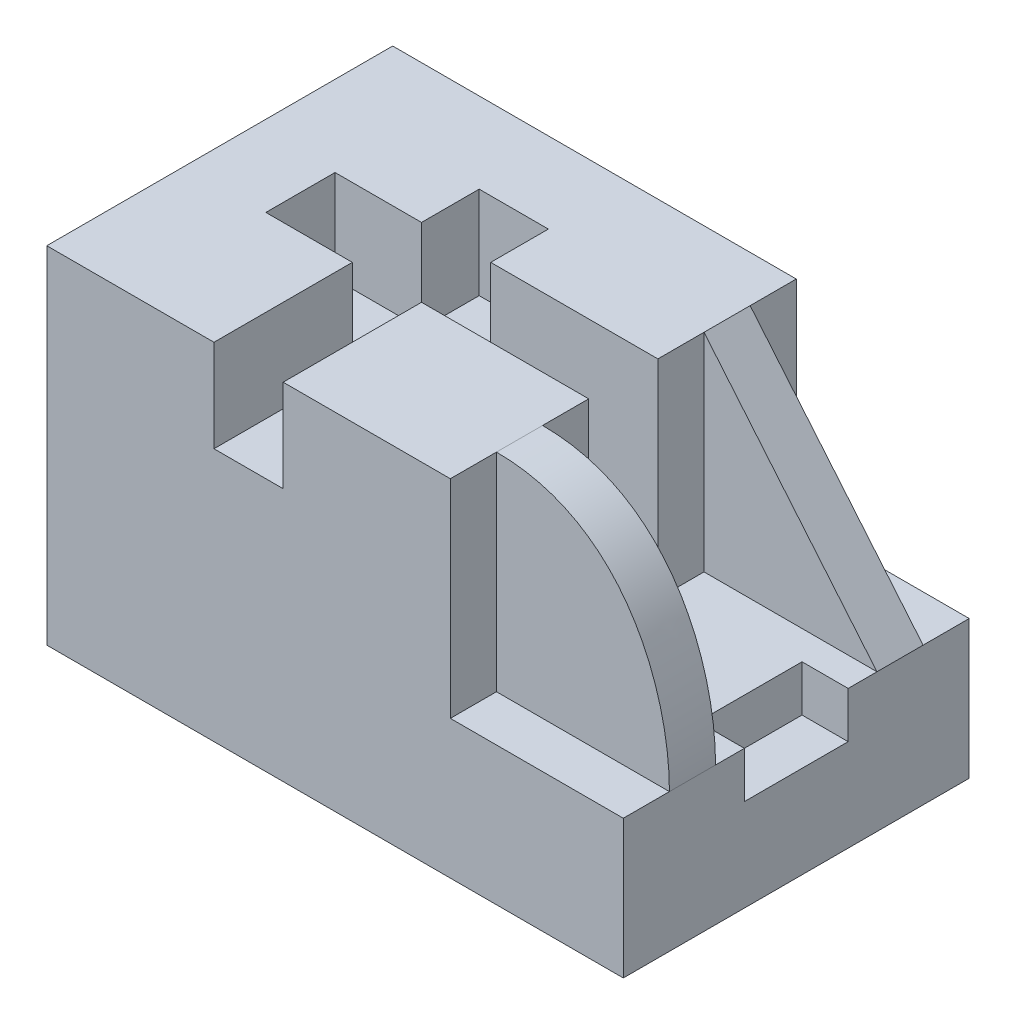
ISO-10303-21;
HEADER;
FILE_DESCRIPTION(('STEP AP214'),'2;1');
FILE_NAME('part.step','',(''),(''),'','','');
FILE_SCHEMA(('AUTOMOTIVE_DESIGN { 1 0 10303 214 1 1 1 1 }'));
ENDSEC;
DATA;
#1=APPLICATION_CONTEXT('core data for automotive mechanical design processes');
#2=APPLICATION_PROTOCOL_DEFINITION('international standard','automotive_design',2000,#1);
#3=PRODUCT_CONTEXT('',#1,'mechanical');
#4=PRODUCT('Part','Part','',(#3));
#5=PRODUCT_RELATED_PRODUCT_CATEGORY('part','',(#4));
#6=PRODUCT_DEFINITION_FORMATION('','',#4);
#7=PRODUCT_DEFINITION_CONTEXT('part definition',#1,'design');
#8=PRODUCT_DEFINITION('design','',#6,#7);
#9=PRODUCT_DEFINITION_SHAPE('','',#8);
#10=(LENGTH_UNIT() NAMED_UNIT(*) SI_UNIT(.MILLI.,.METRE.));
#11=(NAMED_UNIT(*) PLANE_ANGLE_UNIT() SI_UNIT($,.RADIAN.));
#12=(NAMED_UNIT(*) SI_UNIT($,.STERADIAN.) SOLID_ANGLE_UNIT());
#13=UNCERTAINTY_MEASURE_WITH_UNIT(LENGTH_MEASURE(1.E-05),#10,'distance_accuracy_value','');
#14=(GEOMETRIC_REPRESENTATION_CONTEXT(3) GLOBAL_UNCERTAINTY_ASSIGNED_CONTEXT((#13)) GLOBAL_UNIT_ASSIGNED_CONTEXT((#10,
#11,#12)) REPRESENTATION_CONTEXT('',''));
#15=CARTESIAN_POINT('',(0.,0.,0.));
#16=DIRECTION('',(0.,0.,1.));
#17=DIRECTION('',(1.,0.,0.));
#18=AXIS2_PLACEMENT_3D('',#15,#16,#17);
#19=CARTESIAN_POINT('',(25.,-3.,0.));
#20=DIRECTION('',(0.,-1.,0.));
#21=DIRECTION('',(1.,0.,0.));
#22=AXIS2_PLACEMENT_3D('',#19,#20,#21);
#23=PLANE('',#22);
#24=DIRECTION('',(-1.,0.,0.));
#25=VECTOR('',#24,1.);
#26=CARTESIAN_POINT('',(25.,-3.,4.));
#27=LINE('',#26,#25);
#28=CARTESIAN_POINT('',(25.,-3.,4.));
#29=VERTEX_POINT('',#28);
#30=CARTESIAN_POINT('',(10.,-3.,4.));
#31=VERTEX_POINT('',#30);
#32=EDGE_CURVE('E270',#29,#31,#27,.T.);
#33=ORIENTED_EDGE('',*,*,#32,.F.);
#34=DIRECTION('',(0.,0.,1.));
#35=VECTOR('',#34,1.);
#36=CARTESIAN_POINT('',(25.,-3.,0.));
#37=LINE('',#36,#35);
#38=CARTESIAN_POINT('',(25.,-3.,0.));
#39=VERTEX_POINT('',#38);
#40=EDGE_CURVE('E554',#39,#29,#37,.T.);
#41=ORIENTED_EDGE('',*,*,#40,.F.);
#42=DIRECTION('',(1.,0.,0.));
#43=VECTOR('',#42,1.);
#44=CARTESIAN_POINT('',(25.,-3.,0.));
#45=LINE('',#44,#43);
#46=CARTESIAN_POINT('',(10.,-3.,0.));
#47=VERTEX_POINT('',#46);
#48=EDGE_CURVE('E545',#47,#39,#45,.T.);
#49=ORIENTED_EDGE('',*,*,#48,.F.);
#50=DIRECTION('',(0.,0.,1.));
#51=VECTOR('',#50,1.);
#52=CARTESIAN_POINT('',(10.,-3.,0.));
#53=LINE('',#52,#51);
#54=EDGE_CURVE('E559',#47,#31,#53,.T.);
#55=ORIENTED_EDGE('',*,*,#54,.T.);
#56=EDGE_LOOP('',(#33,#41,#49,#55));
#57=FACE_BOUND('',#56,.T.);
#58=ADVANCED_FACE('F34',(#57),#23,.F.);
#59=CARTESIAN_POINT('',(10.,15.,0.));
#60=DIRECTION('',(-1.,0.,0.));
#61=DIRECTION('',(0.,-1.,0.));
#62=AXIS2_PLACEMENT_3D('',#59,#60,#61);
#63=PLANE('',#62);
#64=DIRECTION('',(0.,1.,0.));
#65=VECTOR('',#64,1.);
#66=CARTESIAN_POINT('',(10.,15.,4.));
#67=LINE('',#66,#65);
#68=CARTESIAN_POINT('',(10.,15.,4.));
#69=VERTEX_POINT('',#68);
#70=EDGE_CURVE('E11',#31,#69,#67,.T.);
#71=ORIENTED_EDGE('',*,*,#70,.F.);
#72=ORIENTED_EDGE('',*,*,#54,.F.);
#73=DIRECTION('',(0.,-1.,0.));
#74=VECTOR('',#73,1.);
#75=CARTESIAN_POINT('',(10.,15.,0.));
#76=LINE('',#75,#74);
#77=CARTESIAN_POINT('',(10.,15.,0.));
#78=VERTEX_POINT('',#77);
#79=EDGE_CURVE('E542',#78,#47,#76,.T.);
#80=ORIENTED_EDGE('',*,*,#79,.F.);
#81=DIRECTION('',(0.,0.,1.));
#82=VECTOR('',#81,1.);
#83=CARTESIAN_POINT('',(10.,15.,0.));
#84=LINE('',#83,#82);
#85=EDGE_CURVE('E564',#78,#69,#84,.T.);
#86=ORIENTED_EDGE('',*,*,#85,.T.);
#87=EDGE_LOOP('',(#71,#72,#80,#86));
#88=FACE_BOUND('',#87,.T.);
#89=ADVANCED_FACE('F369',(#88),#63,.F.);
#90=DIRECTION('',(0.,1.,0.));
#91=VECTOR('',#90,1.);
#92=CARTESIAN_POINT('',(10.,15.,22.));
#93=LINE('',#92,#91);
#94=CARTESIAN_POINT('',(10.,-3.,22.));
#95=VERTEX_POINT('',#94);
#96=CARTESIAN_POINT('',(10.,15.,22.));
#97=VERTEX_POINT('',#96);
#98=EDGE_CURVE('E450',#95,#97,#93,.T.);
#99=ORIENTED_EDGE('',*,*,#98,.F.);
#100=CARTESIAN_POINT('',(10.,-3.,18.));
#101=VERTEX_POINT('',#100);
#102=EDGE_CURVE('E563',#101,#95,#53,.T.);
#103=ORIENTED_EDGE('',*,*,#102,.F.);
#104=DIRECTION('',(0.,1.,0.));
#105=VECTOR('',#104,1.);
#106=CARTESIAN_POINT('',(10.,-18.6923548264752,18.));
#107=LINE('',#106,#105);
#108=CARTESIAN_POINT('',(10.,15.,18.));
#109=VERTEX_POINT('',#108);
#110=EDGE_CURVE('E522',#101,#109,#107,.T.);
#111=ORIENTED_EDGE('',*,*,#110,.T.);
#112=EDGE_CURVE('E569',#109,#97,#84,.T.);
#113=ORIENTED_EDGE('',*,*,#112,.T.);
#114=EDGE_LOOP('',(#99,#103,#111,#113));
#115=FACE_BOUND('',#114,.T.);
#116=ADVANCED_FACE('F399',(#115),#63,.F.);
#117=DIRECTION('',(0.,0.,1.));
#118=VECTOR('',#117,1.);
#119=CARTESIAN_POINT('',(21.,-3.,19.5));
#120=LINE('',#119,#118);
#121=CARTESIAN_POINT('',(21.,-3.,10.5));
#122=VERTEX_POINT('',#121);
#123=CARTESIAN_POINT('',(21.,-3.,19.5));
#124=VERTEX_POINT('',#123);
#125=EDGE_CURVE('E232',#122,#124,#120,.T.);
#126=ORIENTED_EDGE('',*,*,#125,.F.);
#127=DIRECTION('',(-1.,0.,0.));
#128=VECTOR('',#127,1.);
#129=CARTESIAN_POINT('',(25.,-3.,10.5));
#130=LINE('',#129,#128);
#131=CARTESIAN_POINT('',(25.,-3.,10.5));
#132=VERTEX_POINT('',#131);
#133=EDGE_CURVE('E245',#132,#122,#130,.T.);
#134=ORIENTED_EDGE('',*,*,#133,.F.);
#135=CARTESIAN_POINT('',(25.,-3.,8.));
#136=VERTEX_POINT('',#135);
#137=EDGE_CURVE('E57',#136,#132,#37,.T.);
#138=ORIENTED_EDGE('',*,*,#137,.F.);
#139=DIRECTION('',(-1.,0.,0.));
#140=VECTOR('',#139,1.);
#141=CARTESIAN_POINT('',(25.,-3.,8.));
#142=LINE('',#141,#140);
#143=CARTESIAN_POINT('',(10.,-3.,8.));
#144=VERTEX_POINT('',#143);
#145=EDGE_CURVE('E268',#136,#144,#142,.T.);
#146=ORIENTED_EDGE('',*,*,#145,.T.);
#147=CARTESIAN_POINT('',(10.,-3.,12.));
#148=VERTEX_POINT('',#147);
#149=EDGE_CURVE('E562',#144,#148,#53,.T.);
#150=ORIENTED_EDGE('',*,*,#149,.T.);
#151=DIRECTION('',(-1.,0.,0.));
#152=VECTOR('',#151,1.);
#153=CARTESIAN_POINT('',(0.,-3.,12.));
#154=LINE('',#153,#152);
#155=CARTESIAN_POINT('',(-4.5,-3.,12.));
#156=VERTEX_POINT('',#155);
#157=EDGE_CURVE('E523',#148,#156,#154,.T.);
#158=ORIENTED_EDGE('',*,*,#157,.T.);
#159=DIRECTION('',(0.,0.,-1.));
#160=VECTOR('',#159,1.);
#161=CARTESIAN_POINT('',(-4.5,-3.,0.));
#162=LINE('',#161,#160);
#163=CARTESIAN_POINT('',(-4.5,-3.,18.));
#164=VERTEX_POINT('',#163);
#165=EDGE_CURVE('E527',#164,#156,#162,.T.);
#166=ORIENTED_EDGE('',*,*,#165,.F.);
#167=DIRECTION('',(-1.,0.,0.));
#168=VECTOR('',#167,1.);
#169=CARTESIAN_POINT('',(0.,-3.,18.));
#170=LINE('',#169,#168);
#171=EDGE_CURVE('E518',#101,#164,#170,.T.);
#172=ORIENTED_EDGE('',*,*,#171,.F.);
#173=ORIENTED_EDGE('',*,*,#102,.T.);
#174=DIRECTION('',(-1.,0.,0.));
#175=VECTOR('',#174,1.);
#176=CARTESIAN_POINT('',(25.,-3.,22.));
#177=LINE('',#176,#175);
#178=CARTESIAN_POINT('',(25.,-3.,22.));
#179=VERTEX_POINT('',#178);
#180=EDGE_CURVE('E654',#179,#95,#177,.T.);
#181=ORIENTED_EDGE('',*,*,#180,.F.);
#182=CARTESIAN_POINT('',(25.,-3.,19.5));
#183=VERTEX_POINT('',#182);
#184=EDGE_CURVE('E408',#183,#179,#37,.T.);
#185=ORIENTED_EDGE('',*,*,#184,.F.);
#186=DIRECTION('',(1.,0.,0.));
#187=VECTOR('',#186,1.);
#188=CARTESIAN_POINT('',(25.,-3.,19.5));
#189=LINE('',#188,#187);
#190=EDGE_CURVE('E248',#124,#183,#189,.T.);
#191=ORIENTED_EDGE('',*,*,#190,.F.);
#192=EDGE_LOOP('',(#126,#134,#138,#146,#150,#158,#166,#172,#173,#181,#185,#191));
#193=FACE_BOUND('',#192,.T.);
#194=ADVANCED_FACE('F365',(#193),#23,.F.);
#195=CARTESIAN_POINT('',(-25.,15.,30.));
#196=DIRECTION('',(0.,-1.,0.));
#197=DIRECTION('',(0.,0.,-1.));
#198=AXIS2_PLACEMENT_3D('',#195,#196,#197);
#199=PLANE('',#198);
#200=DIRECTION('',(0.,0.,-1.));
#201=VECTOR('',#200,1.);
#202=CARTESIAN_POINT('',(-10.5,15.,0.));
#203=LINE('',#202,#201);
#204=CARTESIAN_POINT('',(-10.5,15.,12.));
#205=VERTEX_POINT('',#204);
#206=CARTESIAN_POINT('',(-10.5,15.,7.));
#207=VERTEX_POINT('',#206);
#208=EDGE_CURVE('E482',#205,#207,#203,.T.);
#209=ORIENTED_EDGE('',*,*,#208,.T.);
#210=DIRECTION('',(-1.,0.,0.));
#211=VECTOR('',#210,1.);
#212=CARTESIAN_POINT('',(0.,15.,7.));
#213=LINE('',#212,#211);
#214=CARTESIAN_POINT('',(-4.5,15.,7.));
#215=VERTEX_POINT('',#214);
#216=EDGE_CURVE('E479',#215,#207,#213,.T.);
#217=ORIENTED_EDGE('',*,*,#216,.F.);
#218=DIRECTION('',(0.,0.,-1.));
#219=VECTOR('',#218,1.);
#220=CARTESIAN_POINT('',(-4.5,15.,0.));
#221=LINE('',#220,#219);
#222=CARTESIAN_POINT('',(-4.5,15.,12.));
#223=VERTEX_POINT('',#222);
#224=EDGE_CURVE('E448',#223,#215,#221,.T.);
#225=ORIENTED_EDGE('',*,*,#224,.F.);
#226=DIRECTION('',(-1.,0.,0.));
#227=VECTOR('',#226,1.);
#228=CARTESIAN_POINT('',(0.,15.,12.));
#229=LINE('',#228,#227);
#230=CARTESIAN_POINT('',(10.,15.,12.));
#231=VERTEX_POINT('',#230);
#232=EDGE_CURVE('E515',#231,#223,#229,.T.);
#233=ORIENTED_EDGE('',*,*,#232,.F.);
#234=CARTESIAN_POINT('',(10.,15.,8.));
#235=VERTEX_POINT('',#234);
#236=EDGE_CURVE('E568',#235,#231,#84,.T.);
#237=ORIENTED_EDGE('',*,*,#236,.F.);
#238=EDGE_CURVE('E567',#69,#235,#84,.T.);
#239=ORIENTED_EDGE('',*,*,#238,.F.);
#240=ORIENTED_EDGE('',*,*,#85,.F.);
#241=DIRECTION('',(-1.,0.,0.));
#242=VECTOR('',#241,1.);
#243=CARTESIAN_POINT('',(-25.,15.,0.));
#244=LINE('',#243,#242);
#245=CARTESIAN_POINT('',(-25.,15.,0.));
#246=VERTEX_POINT('',#245);
#247=EDGE_CURVE('E585',#78,#246,#244,.T.);
#248=ORIENTED_EDGE('',*,*,#247,.T.);
#249=DIRECTION('',(0.,0.,-1.));
#250=VECTOR('',#249,1.);
#251=CARTESIAN_POINT('',(-25.,15.,30.));
#252=LINE('',#251,#250);
#253=CARTESIAN_POINT('',(-25.,15.,30.));
#254=VERTEX_POINT('',#253);
#255=EDGE_CURVE('E42',#254,#246,#252,.T.);
#256=ORIENTED_EDGE('',*,*,#255,.F.);
#257=DIRECTION('',(-1.,0.,0.));
#258=VECTOR('',#257,1.);
#259=CARTESIAN_POINT('',(-25.,15.,30.));
#260=LINE('',#259,#258);
#261=CARTESIAN_POINT('',(-10.5,15.,30.));
#262=VERTEX_POINT('',#261);
#263=EDGE_CURVE('E573',#262,#254,#260,.T.);
#264=ORIENTED_EDGE('',*,*,#263,.F.);
#265=DIRECTION('',(0.,0.,-1.));
#266=VECTOR('',#265,1.);
#267=CARTESIAN_POINT('',(-10.5,15.,0.));
#268=LINE('',#267,#266);
#269=CARTESIAN_POINT('',(-10.5,15.,18.));
#270=VERTEX_POINT('',#269);
#271=EDGE_CURVE('E446',#262,#270,#268,.T.);
#272=ORIENTED_EDGE('',*,*,#271,.T.);
#273=DIRECTION('',(-1.,0.,0.));
#274=VECTOR('',#273,1.);
#275=CARTESIAN_POINT('',(0.,15.,18.));
#276=LINE('',#275,#274);
#277=CARTESIAN_POINT('',(-18.,15.,18.));
#278=VERTEX_POINT('',#277);
#279=EDGE_CURVE('E457',#270,#278,#276,.T.);
#280=ORIENTED_EDGE('',*,*,#279,.T.);
#281=DIRECTION('',(0.,0.,-1.));
#282=VECTOR('',#281,1.);
#283=CARTESIAN_POINT('',(-18.,15.,0.));
#284=LINE('',#283,#282);
#285=CARTESIAN_POINT('',(-18.,15.,12.));
#286=VERTEX_POINT('',#285);
#287=EDGE_CURVE('E487',#278,#286,#284,.T.);
#288=ORIENTED_EDGE('',*,*,#287,.T.);
#289=DIRECTION('',(-1.,0.,0.));
#290=VECTOR('',#289,1.);
#291=CARTESIAN_POINT('',(0.,15.,12.));
#292=LINE('',#291,#290);
#293=EDGE_CURVE('E484',#205,#286,#292,.T.);
#294=ORIENTED_EDGE('',*,*,#293,.F.);
#295=EDGE_LOOP('',(#209,#217,#225,#233,#237,#239,#240,#248,#256,#264,#272,#280,#288,#294));
#296=FACE_BOUND('',#295,.T.);
#297=ADVANCED_FACE('F372',(#296),#199,.F.);
#298=CARTESIAN_POINT('',(0.,0.,30.));
#299=DIRECTION('',(0.,0.,-1.));
#300=DIRECTION('',(-1.,0.,0.));
#301=AXIS2_PLACEMENT_3D('',#298,#299,#300);
#302=PLANE('',#301);
#303=DIRECTION('',(0.,1.,0.));
#304=VECTOR('',#303,1.);
#305=CARTESIAN_POINT('',(-10.5,7.,30.));
#306=LINE('',#305,#304);
#307=CARTESIAN_POINT('',(-10.5,7.,30.));
#308=VERTEX_POINT('',#307);
#309=EDGE_CURVE('E475',#308,#262,#306,.T.);
#310=ORIENTED_EDGE('',*,*,#309,.T.);
#311=ORIENTED_EDGE('',*,*,#263,.T.);
#312=DIRECTION('',(0.,-1.,0.));
#313=VECTOR('',#312,1.);
#314=CARTESIAN_POINT('',(-25.,-15.,30.));
#315=LINE('',#314,#313);
#316=CARTESIAN_POINT('',(-25.,-15.,30.));
#317=VERTEX_POINT('',#316);
#318=EDGE_CURVE('E578',#254,#317,#315,.T.);
#319=ORIENTED_EDGE('',*,*,#318,.T.);
#320=DIRECTION('',(1.,0.,0.));
#321=VECTOR('',#320,1.);
#322=CARTESIAN_POINT('',(-25.,-15.,30.));
#323=LINE('',#322,#321);
#324=CARTESIAN_POINT('',(25.,-15.,30.));
#325=VERTEX_POINT('',#324);
#326=EDGE_CURVE('E580',#317,#325,#323,.T.);
#327=ORIENTED_EDGE('',*,*,#326,.T.);
#328=DIRECTION('',(0.,1.,0.));
#329=VECTOR('',#328,1.);
#330=CARTESIAN_POINT('',(25.,-15.,30.));
#331=LINE('',#330,#329);
#332=CARTESIAN_POINT('',(25.,-3.,30.));
#333=VERTEX_POINT('',#332);
#334=EDGE_CURVE('E570',#325,#333,#331,.T.);
#335=ORIENTED_EDGE('',*,*,#334,.T.);
#336=DIRECTION('',(1.,0.,0.));
#337=VECTOR('',#336,1.);
#338=CARTESIAN_POINT('',(25.,-3.,30.));
#339=LINE('',#338,#337);
#340=CARTESIAN_POINT('',(10.,-3.,30.));
#341=VERTEX_POINT('',#340);
#342=EDGE_CURVE('E546',#341,#333,#339,.T.);
#343=ORIENTED_EDGE('',*,*,#342,.F.);
#344=DIRECTION('',(0.,-1.,0.));
#345=VECTOR('',#344,1.);
#346=CARTESIAN_POINT('',(10.,15.,30.));
#347=LINE('',#346,#345);
#348=CARTESIAN_POINT('',(10.,15.,30.));
#349=VERTEX_POINT('',#348);
#350=EDGE_CURVE('E530',#349,#341,#347,.T.);
#351=ORIENTED_EDGE('',*,*,#350,.F.);
#352=CARTESIAN_POINT('',(-4.5,15.,30.));
#353=VERTEX_POINT('',#352);
#354=EDGE_CURVE('E575',#349,#353,#260,.T.);
#355=ORIENTED_EDGE('',*,*,#354,.T.);
#356=DIRECTION('',(0.,1.,0.));
#357=VECTOR('',#356,1.);
#358=CARTESIAN_POINT('',(-4.5,7.,30.));
#359=LINE('',#358,#357);
#360=CARTESIAN_POINT('',(-4.5,7.,30.));
#361=VERTEX_POINT('',#360);
#362=EDGE_CURVE('E508',#361,#353,#359,.T.);
#363=ORIENTED_EDGE('',*,*,#362,.F.);
#364=DIRECTION('',(1.,0.,0.));
#365=VECTOR('',#364,1.);
#366=CARTESIAN_POINT('',(0.,7.,30.));
#367=LINE('',#366,#365);
#368=EDGE_CURVE('E456',#308,#361,#367,.T.);
#369=ORIENTED_EDGE('',*,*,#368,.F.);
#370=EDGE_LOOP('',(#310,#311,#319,#327,#335,#343,#351,#355,#363,#369));
#371=FACE_BOUND('',#370,.T.);
#372=ADVANCED_FACE('F358',(#371),#302,.F.);
#373=CARTESIAN_POINT('',(-4.5,-18.6923548264752,0.));
#374=DIRECTION('',(1.,0.,0.));
#375=DIRECTION('',(0.,0.,-1.));
#376=AXIS2_PLACEMENT_3D('',#373,#374,#375);
#377=PLANE('',#376);
#378=DIRECTION('',(0.,1.,0.));
#379=VECTOR('',#378,1.);
#380=CARTESIAN_POINT('',(-4.5,-18.6923548264752,12.));
#381=LINE('',#380,#379);
#382=CARTESIAN_POINT('',(-4.5,7.,12.));
#383=VERTEX_POINT('',#382);
#384=EDGE_CURVE('E525',#156,#383,#381,.T.);
#385=ORIENTED_EDGE('',*,*,#384,.T.);
#386=DIRECTION('',(0.,0.,-1.));
#387=VECTOR('',#386,1.);
#388=CARTESIAN_POINT('',(-4.5,7.,0.));
#389=LINE('',#388,#387);
#390=CARTESIAN_POINT('',(-4.5,7.,18.));
#391=VERTEX_POINT('',#390);
#392=EDGE_CURVE('E464',#391,#383,#389,.T.);
#393=ORIENTED_EDGE('',*,*,#392,.F.);
#394=DIRECTION('',(0.,1.,0.));
#395=VECTOR('',#394,1.);
#396=CARTESIAN_POINT('',(-4.5,-18.6923548264752,18.));
#397=LINE('',#396,#395);
#398=EDGE_CURVE('E526',#164,#391,#397,.T.);
#399=ORIENTED_EDGE('',*,*,#398,.F.);
#400=ORIENTED_EDGE('',*,*,#165,.T.);
#401=EDGE_LOOP('',(#385,#393,#399,#400));
#402=FACE_BOUND('',#401,.T.);
#403=ADVANCED_FACE('F354',(#402),#377,.T.);
#404=CARTESIAN_POINT('',(10.,-3.,26.));
#405=VERTEX_POINT('',#404);
#406=EDGE_CURVE('E566',#405,#341,#53,.T.);
#407=ORIENTED_EDGE('',*,*,#406,.F.);
#408=DIRECTION('',(0.,1.,0.));
#409=VECTOR('',#408,1.);
#410=CARTESIAN_POINT('',(10.,15.,26.));
#411=LINE('',#410,#409);
#412=CARTESIAN_POINT('',(10.,15.,26.));
#413=VERTEX_POINT('',#412);
#414=EDGE_CURVE('E442',#405,#413,#411,.T.);
#415=ORIENTED_EDGE('',*,*,#414,.T.);
#416=EDGE_CURVE('E549',#413,#349,#84,.T.);
#417=ORIENTED_EDGE('',*,*,#416,.T.);
#418=ORIENTED_EDGE('',*,*,#350,.T.);
#419=EDGE_LOOP('',(#407,#415,#417,#418));
#420=FACE_BOUND('',#419,.T.);
#421=ADVANCED_FACE('F357',(#420),#63,.F.);
#422=CARTESIAN_POINT('',(25.,-15.,30.));
#423=DIRECTION('',(-1.,0.,0.));
#424=DIRECTION('',(0.,0.,1.));
#425=AXIS2_PLACEMENT_3D('',#422,#423,#424);
#426=PLANE('',#425);
#427=ORIENTED_EDGE('',*,*,#137,.T.);
#428=DIRECTION('',(0.,1.,0.));
#429=VECTOR('',#428,1.);
#430=CARTESIAN_POINT('',(25.,-7.,10.5));
#431=LINE('',#430,#429);
#432=CARTESIAN_POINT('',(25.,-7.,10.5));
#433=VERTEX_POINT('',#432);
#434=EDGE_CURVE('E258',#433,#132,#431,.T.);
#435=ORIENTED_EDGE('',*,*,#434,.F.);
#436=DIRECTION('',(0.,0.,-1.));
#437=VECTOR('',#436,1.);
#438=CARTESIAN_POINT('',(25.,-7.,19.5));
#439=LINE('',#438,#437);
#440=CARTESIAN_POINT('',(25.,-7.,19.5));
#441=VERTEX_POINT('',#440);
#442=EDGE_CURVE('E241',#441,#433,#439,.T.);
#443=ORIENTED_EDGE('',*,*,#442,.F.);
#444=DIRECTION('',(0.,1.,0.));
#445=VECTOR('',#444,1.);
#446=CARTESIAN_POINT('',(25.,-7.,19.5));
#447=LINE('',#446,#445);
#448=EDGE_CURVE('E235',#441,#183,#447,.T.);
#449=ORIENTED_EDGE('',*,*,#448,.T.);
#450=ORIENTED_EDGE('',*,*,#184,.T.);
#451=DIRECTION('',(0.,0.,1.));
#452=VECTOR('',#451,1.);
#453=CARTESIAN_POINT('',(25.,-3.,24.));
#454=LINE('',#453,#452);
#455=CARTESIAN_POINT('',(25.,-3.,26.));
#456=VERTEX_POINT('',#455);
#457=EDGE_CURVE('E297',#179,#456,#454,.T.);
#458=ORIENTED_EDGE('',*,*,#457,.T.);
#459=EDGE_CURVE('E558',#456,#333,#37,.T.);
#460=ORIENTED_EDGE('',*,*,#459,.T.);
#461=ORIENTED_EDGE('',*,*,#334,.F.);
#462=DIRECTION('',(0.,0.,-1.));
#463=VECTOR('',#462,1.);
#464=CARTESIAN_POINT('',(25.,-15.,30.));
#465=LINE('',#464,#463);
#466=CARTESIAN_POINT('',(25.,-15.,0.));
#467=VERTEX_POINT('',#466);
#468=EDGE_CURVE('E582',#325,#467,#465,.T.);
#469=ORIENTED_EDGE('',*,*,#468,.T.);
#470=DIRECTION('',(0.,1.,0.));
#471=VECTOR('',#470,1.);
#472=CARTESIAN_POINT('',(25.,-15.,0.));
#473=LINE('',#472,#471);
#474=EDGE_CURVE('E557',#467,#39,#473,.T.);
#475=ORIENTED_EDGE('',*,*,#474,.T.);
#476=ORIENTED_EDGE('',*,*,#40,.T.);
#477=DIRECTION('',(0.,0.,-1.));
#478=VECTOR('',#477,1.);
#479=CARTESIAN_POINT('',(25.,-3.,30.));
#480=LINE('',#479,#478);
#481=EDGE_CURVE('E273',#136,#29,#480,.T.);
#482=ORIENTED_EDGE('',*,*,#481,.F.);
#483=EDGE_LOOP('',(#427,#435,#443,#449,#450,#458,#460,#461,#469,#475,#476,#482));
#484=FACE_BOUND('',#483,.T.);
#485=ADVANCED_FACE('F36',(#484),#426,.F.);
#486=ORIENTED_EDGE('',*,*,#416,.F.);
#487=DIRECTION('',(0.,0.,1.));
#488=VECTOR('',#487,1.);
#489=CARTESIAN_POINT('',(10.,15.,24.));
#490=LINE('',#489,#488);
#491=EDGE_CURVE('E282',#97,#413,#490,.T.);
#492=ORIENTED_EDGE('',*,*,#491,.F.);
#493=ORIENTED_EDGE('',*,*,#112,.F.);
#494=DIRECTION('',(-1.,0.,0.));
#495=VECTOR('',#494,1.);
#496=CARTESIAN_POINT('',(0.,15.,18.));
#497=LINE('',#496,#495);
#498=CARTESIAN_POINT('',(-4.5,15.,18.));
#499=VERTEX_POINT('',#498);
#500=EDGE_CURVE('E519',#109,#499,#497,.T.);
#501=ORIENTED_EDGE('',*,*,#500,.T.);
#502=EDGE_CURVE('E477',#353,#499,#221,.T.);
#503=ORIENTED_EDGE('',*,*,#502,.F.);
#504=ORIENTED_EDGE('',*,*,#354,.F.);
#505=EDGE_LOOP('',(#486,#492,#493,#501,#503,#504));
#506=FACE_BOUND('',#505,.T.);
#507=ADVANCED_FACE('F383',(#506),#199,.F.);
#508=CARTESIAN_POINT('',(-25.,-15.,30.));
#509=DIRECTION('',(1.,0.,0.));
#510=DIRECTION('',(0.,0.,-1.));
#511=AXIS2_PLACEMENT_3D('',#508,#509,#510);
#512=PLANE('',#511);
#513=ORIENTED_EDGE('',*,*,#255,.T.);
#514=DIRECTION('',(0.,-1.,0.));
#515=VECTOR('',#514,1.);
#516=CARTESIAN_POINT('',(-25.,-15.,0.));
#517=LINE('',#516,#515);
#518=CARTESIAN_POINT('',(-25.,-15.,0.));
#519=VERTEX_POINT('',#518);
#520=EDGE_CURVE('E588',#246,#519,#517,.T.);
#521=ORIENTED_EDGE('',*,*,#520,.T.);
#522=DIRECTION('',(0.,0.,-1.));
#523=VECTOR('',#522,1.);
#524=CARTESIAN_POINT('',(-25.,-15.,30.));
#525=LINE('',#524,#523);
#526=EDGE_CURVE('E594',#317,#519,#525,.T.);
#527=ORIENTED_EDGE('',*,*,#526,.F.);
#528=ORIENTED_EDGE('',*,*,#318,.F.);
#529=EDGE_LOOP('',(#513,#521,#527,#528));
#530=FACE_BOUND('',#529,.T.);
#531=ADVANCED_FACE('F380',(#530),#512,.F.);
#532=CARTESIAN_POINT('',(-25.,-15.,30.));
#533=DIRECTION('',(0.,1.,0.));
#534=DIRECTION('',(0.,0.,1.));
#535=AXIS2_PLACEMENT_3D('',#532,#533,#534);
#536=PLANE('',#535);
#537=ORIENTED_EDGE('',*,*,#526,.T.);
#538=DIRECTION('',(1.,0.,0.));
#539=VECTOR('',#538,1.);
#540=CARTESIAN_POINT('',(-25.,-15.,0.));
#541=LINE('',#540,#539);
#542=EDGE_CURVE('E574',#519,#467,#541,.T.);
#543=ORIENTED_EDGE('',*,*,#542,.T.);
#544=ORIENTED_EDGE('',*,*,#468,.F.);
#545=ORIENTED_EDGE('',*,*,#326,.F.);
#546=EDGE_LOOP('',(#537,#543,#544,#545));
#547=FACE_BOUND('',#546,.T.);
#548=ADVANCED_FACE('F376',(#547),#536,.F.);
#549=CARTESIAN_POINT('',(0.,0.,0.));
#550=DIRECTION('',(0.,0.,-1.));
#551=DIRECTION('',(-1.,0.,0.));
#552=AXIS2_PLACEMENT_3D('',#549,#550,#551);
#553=PLANE('',#552);
#554=ORIENTED_EDGE('',*,*,#48,.T.);
#555=ORIENTED_EDGE('',*,*,#474,.F.);
#556=ORIENTED_EDGE('',*,*,#542,.F.);
#557=ORIENTED_EDGE('',*,*,#520,.F.);
#558=ORIENTED_EDGE('',*,*,#247,.F.);
#559=ORIENTED_EDGE('',*,*,#79,.T.);
#560=EDGE_LOOP('',(#554,#555,#556,#557,#558,#559));
#561=FACE_BOUND('',#560,.T.);
#562=ADVANCED_FACE('F363',(#561),#553,.T.);
#563=ORIENTED_EDGE('',*,*,#459,.F.);
#564=DIRECTION('',(-1.,0.,0.));
#565=VECTOR('',#564,1.);
#566=CARTESIAN_POINT('',(25.,-3.,26.));
#567=LINE('',#566,#565);
#568=EDGE_CURVE('E443',#456,#405,#567,.T.);
#569=ORIENTED_EDGE('',*,*,#568,.T.);
#570=ORIENTED_EDGE('',*,*,#406,.T.);
#571=ORIENTED_EDGE('',*,*,#342,.T.);
#572=EDGE_LOOP('',(#563,#569,#570,#571));
#573=FACE_BOUND('',#572,.T.);
#574=ADVANCED_FACE('F360',(#573),#23,.F.);
#575=ORIENTED_EDGE('',*,*,#149,.F.);
#576=DIRECTION('',(0.,1.,0.));
#577=VECTOR('',#576,1.);
#578=CARTESIAN_POINT('',(10.,15.,8.));
#579=LINE('',#578,#577);
#580=EDGE_CURVE('E264',#144,#235,#579,.T.);
#581=ORIENTED_EDGE('',*,*,#580,.T.);
#582=ORIENTED_EDGE('',*,*,#236,.T.);
#583=DIRECTION('',(0.,1.,0.));
#584=VECTOR('',#583,1.);
#585=CARTESIAN_POINT('',(10.,-18.6923548264752,12.));
#586=LINE('',#585,#584);
#587=EDGE_CURVE('E535',#148,#231,#586,.T.);
#588=ORIENTED_EDGE('',*,*,#587,.F.);
#589=EDGE_LOOP('',(#575,#581,#582,#588));
#590=FACE_BOUND('',#589,.T.);
#591=ADVANCED_FACE('F352',(#590),#63,.F.);
#592=CARTESIAN_POINT('',(0.,-18.6923548264752,12.));
#593=DIRECTION('',(0.,0.,-1.));
#594=DIRECTION('',(-1.,0.,0.));
#595=AXIS2_PLACEMENT_3D('',#592,#593,#594);
#596=PLANE('',#595);
#597=ORIENTED_EDGE('',*,*,#587,.T.);
#598=ORIENTED_EDGE('',*,*,#232,.T.);
#599=DIRECTION('',(0.,-1.,0.));
#600=VECTOR('',#599,1.);
#601=CARTESIAN_POINT('',(-4.5,-18.6923548264752,12.));
#602=LINE('',#601,#600);
#603=EDGE_CURVE('E495',#223,#383,#602,.T.);
#604=ORIENTED_EDGE('',*,*,#603,.T.);
#605=ORIENTED_EDGE('',*,*,#384,.F.);
#606=ORIENTED_EDGE('',*,*,#157,.F.);
#607=EDGE_LOOP('',(#597,#598,#604,#605,#606));
#608=FACE_BOUND('',#607,.T.);
#609=ADVANCED_FACE('F348',(#608),#596,.F.);
#610=CARTESIAN_POINT('',(0.,-18.6923548264752,18.));
#611=DIRECTION('',(0.,0.,-1.));
#612=DIRECTION('',(-1.,0.,0.));
#613=AXIS2_PLACEMENT_3D('',#610,#611,#612);
#614=PLANE('',#613);
#615=ORIENTED_EDGE('',*,*,#171,.T.);
#616=ORIENTED_EDGE('',*,*,#398,.T.);
#617=EDGE_CURVE('E514',#391,#499,#397,.T.);
#618=ORIENTED_EDGE('',*,*,#617,.T.);
#619=ORIENTED_EDGE('',*,*,#500,.F.);
#620=ORIENTED_EDGE('',*,*,#110,.F.);
#621=EDGE_LOOP('',(#615,#616,#618,#619,#620));
#622=FACE_BOUND('',#621,.T.);
#623=ADVANCED_FACE('F345',(#622),#614,.T.);
#624=CARTESIAN_POINT('',(-4.5,7.,0.));
#625=DIRECTION('',(1.,0.,0.));
#626=DIRECTION('',(0.,0.,-1.));
#627=AXIS2_PLACEMENT_3D('',#624,#625,#626);
#628=PLANE('',#627);
#629=ORIENTED_EDGE('',*,*,#224,.T.);
#630=DIRECTION('',(0.,1.,0.));
#631=VECTOR('',#630,1.);
#632=CARTESIAN_POINT('',(-4.5,7.,7.));
#633=LINE('',#632,#631);
#634=CARTESIAN_POINT('',(-4.5,7.,7.));
#635=VERTEX_POINT('',#634);
#636=EDGE_CURVE('E505',#635,#215,#633,.T.);
#637=ORIENTED_EDGE('',*,*,#636,.F.);
#638=EDGE_CURVE('E460',#383,#635,#389,.T.);
#639=ORIENTED_EDGE('',*,*,#638,.F.);
#640=ORIENTED_EDGE('',*,*,#603,.F.);
#641=EDGE_LOOP('',(#629,#637,#639,#640));
#642=FACE_BOUND('',#641,.T.);
#643=ADVANCED_FACE('F341',(#642),#628,.F.);
#644=CARTESIAN_POINT('',(-10.5,7.,0.));
#645=DIRECTION('',(1.,0.,0.));
#646=DIRECTION('',(0.,0.,-1.));
#647=AXIS2_PLACEMENT_3D('',#644,#645,#646);
#648=PLANE('',#647);
#649=DIRECTION('',(0.,0.,-1.));
#650=VECTOR('',#649,1.);
#651=CARTESIAN_POINT('',(-10.5,7.,0.));
#652=LINE('',#651,#650);
#653=CARTESIAN_POINT('',(-10.5,7.,18.));
#654=VERTEX_POINT('',#653);
#655=EDGE_CURVE('E454',#308,#654,#652,.T.);
#656=ORIENTED_EDGE('',*,*,#655,.T.);
#657=DIRECTION('',(0.,1.,0.));
#658=VECTOR('',#657,1.);
#659=CARTESIAN_POINT('',(-10.5,7.,18.));
#660=LINE('',#659,#658);
#661=EDGE_CURVE('E492',#654,#270,#660,.T.);
#662=ORIENTED_EDGE('',*,*,#661,.T.);
#663=ORIENTED_EDGE('',*,*,#271,.F.);
#664=ORIENTED_EDGE('',*,*,#309,.F.);
#665=EDGE_LOOP('',(#656,#662,#663,#664));
#666=FACE_BOUND('',#665,.T.);
#667=ADVANCED_FACE('F321',(#666),#648,.T.);
#668=CARTESIAN_POINT('',(0.,7.,18.));
#669=DIRECTION('',(0.,0.,-1.));
#670=DIRECTION('',(-1.,0.,0.));
#671=AXIS2_PLACEMENT_3D('',#668,#669,#670);
#672=PLANE('',#671);
#673=ORIENTED_EDGE('',*,*,#279,.F.);
#674=ORIENTED_EDGE('',*,*,#661,.F.);
#675=DIRECTION('',(-1.,0.,0.));
#676=VECTOR('',#675,1.);
#677=CARTESIAN_POINT('',(0.,7.,18.));
#678=LINE('',#677,#676);
#679=CARTESIAN_POINT('',(-18.,7.,18.));
#680=VERTEX_POINT('',#679);
#681=EDGE_CURVE('E474',#654,#680,#678,.T.);
#682=ORIENTED_EDGE('',*,*,#681,.T.);
#683=DIRECTION('',(0.,1.,0.));
#684=VECTOR('',#683,1.);
#685=CARTESIAN_POINT('',(-18.,7.,18.));
#686=LINE('',#685,#684);
#687=EDGE_CURVE('E496',#680,#278,#686,.T.);
#688=ORIENTED_EDGE('',*,*,#687,.T.);
#689=EDGE_LOOP('',(#673,#674,#682,#688));
#690=FACE_BOUND('',#689,.T.);
#691=ADVANCED_FACE('F317',(#690),#672,.T.);
#692=CARTESIAN_POINT('',(-18.,7.,0.));
#693=DIRECTION('',(1.,0.,0.));
#694=DIRECTION('',(0.,0.,-1.));
#695=AXIS2_PLACEMENT_3D('',#692,#693,#694);
#696=PLANE('',#695);
#697=ORIENTED_EDGE('',*,*,#287,.F.);
#698=ORIENTED_EDGE('',*,*,#687,.F.);
#699=DIRECTION('',(0.,0.,-1.));
#700=VECTOR('',#699,1.);
#701=CARTESIAN_POINT('',(-18.,7.,0.));
#702=LINE('',#701,#700);
#703=CARTESIAN_POINT('',(-18.,7.,12.));
#704=VERTEX_POINT('',#703);
#705=EDGE_CURVE('E472',#680,#704,#702,.T.);
#706=ORIENTED_EDGE('',*,*,#705,.T.);
#707=DIRECTION('',(0.,1.,0.));
#708=VECTOR('',#707,1.);
#709=CARTESIAN_POINT('',(-18.,7.,12.));
#710=LINE('',#709,#708);
#711=EDGE_CURVE('E498',#704,#286,#710,.T.);
#712=ORIENTED_EDGE('',*,*,#711,.T.);
#713=EDGE_LOOP('',(#697,#698,#706,#712));
#714=FACE_BOUND('',#713,.T.);
#715=ADVANCED_FACE('F320',(#714),#696,.T.);
#716=CARTESIAN_POINT('',(0.,7.,12.));
#717=DIRECTION('',(0.,0.,-1.));
#718=DIRECTION('',(-1.,0.,0.));
#719=AXIS2_PLACEMENT_3D('',#716,#717,#718);
#720=PLANE('',#719);
#721=ORIENTED_EDGE('',*,*,#293,.T.);
#722=ORIENTED_EDGE('',*,*,#711,.F.);
#723=DIRECTION('',(-1.,0.,0.));
#724=VECTOR('',#723,1.);
#725=CARTESIAN_POINT('',(0.,7.,12.));
#726=LINE('',#725,#724);
#727=CARTESIAN_POINT('',(-10.5,7.,12.));
#728=VERTEX_POINT('',#727);
#729=EDGE_CURVE('E469',#728,#704,#726,.T.);
#730=ORIENTED_EDGE('',*,*,#729,.F.);
#731=DIRECTION('',(0.,1.,0.));
#732=VECTOR('',#731,1.);
#733=CARTESIAN_POINT('',(-10.5,7.,12.));
#734=LINE('',#733,#732);
#735=EDGE_CURVE('E500',#728,#205,#734,.T.);
#736=ORIENTED_EDGE('',*,*,#735,.T.);
#737=EDGE_LOOP('',(#721,#722,#730,#736));
#738=FACE_BOUND('',#737,.T.);
#739=ADVANCED_FACE('F325',(#738),#720,.F.);
#740=CARTESIAN_POINT('',(-10.5,7.,0.));
#741=DIRECTION('',(1.,0.,0.));
#742=DIRECTION('',(0.,0.,-1.));
#743=AXIS2_PLACEMENT_3D('',#740,#741,#742);
#744=PLANE('',#743);
#745=DIRECTION('',(0.,0.,-1.));
#746=VECTOR('',#745,1.);
#747=CARTESIAN_POINT('',(-10.5,7.,0.));
#748=LINE('',#747,#746);
#749=CARTESIAN_POINT('',(-10.5,7.,7.));
#750=VERTEX_POINT('',#749);
#751=EDGE_CURVE('E467',#728,#750,#748,.T.);
#752=ORIENTED_EDGE('',*,*,#751,.T.);
#753=DIRECTION('',(0.,1.,0.));
#754=VECTOR('',#753,1.);
#755=CARTESIAN_POINT('',(-10.5,7.,7.));
#756=LINE('',#755,#754);
#757=EDGE_CURVE('E502',#750,#207,#756,.T.);
#758=ORIENTED_EDGE('',*,*,#757,.T.);
#759=ORIENTED_EDGE('',*,*,#208,.F.);
#760=ORIENTED_EDGE('',*,*,#735,.F.);
#761=EDGE_LOOP('',(#752,#758,#759,#760));
#762=FACE_BOUND('',#761,.T.);
#763=ADVANCED_FACE('F329',(#762),#744,.T.);
#764=CARTESIAN_POINT('',(0.,7.,7.));
#765=DIRECTION('',(0.,0.,-1.));
#766=DIRECTION('',(-1.,0.,0.));
#767=AXIS2_PLACEMENT_3D('',#764,#765,#766);
#768=PLANE('',#767);
#769=ORIENTED_EDGE('',*,*,#216,.T.);
#770=ORIENTED_EDGE('',*,*,#757,.F.);
#771=DIRECTION('',(-1.,0.,0.));
#772=VECTOR('',#771,1.);
#773=CARTESIAN_POINT('',(0.,7.,7.));
#774=LINE('',#773,#772);
#775=EDGE_CURVE('E463',#635,#750,#774,.T.);
#776=ORIENTED_EDGE('',*,*,#775,.F.);
#777=ORIENTED_EDGE('',*,*,#636,.T.);
#778=EDGE_LOOP('',(#769,#770,#776,#777));
#779=FACE_BOUND('',#778,.T.);
#780=ADVANCED_FACE('F333',(#779),#768,.F.);
#781=ORIENTED_EDGE('',*,*,#502,.T.);
#782=ORIENTED_EDGE('',*,*,#617,.F.);
#783=EDGE_CURVE('E461',#361,#391,#389,.T.);
#784=ORIENTED_EDGE('',*,*,#783,.F.);
#785=ORIENTED_EDGE('',*,*,#362,.T.);
#786=EDGE_LOOP('',(#781,#782,#784,#785));
#787=FACE_BOUND('',#786,.T.);
#788=ADVANCED_FACE('F315',(#787),#628,.F.);
#789=CARTESIAN_POINT('',(0.,7.,0.));
#790=DIRECTION('',(0.,1.,0.));
#791=DIRECTION('',(0.,0.,1.));
#792=AXIS2_PLACEMENT_3D('',#789,#790,#791);
#793=PLANE('',#792);
#794=ORIENTED_EDGE('',*,*,#638,.T.);
#795=ORIENTED_EDGE('',*,*,#775,.T.);
#796=ORIENTED_EDGE('',*,*,#751,.F.);
#797=ORIENTED_EDGE('',*,*,#729,.T.);
#798=ORIENTED_EDGE('',*,*,#705,.F.);
#799=ORIENTED_EDGE('',*,*,#681,.F.);
#800=ORIENTED_EDGE('',*,*,#655,.F.);
#801=ORIENTED_EDGE('',*,*,#368,.T.);
#802=ORIENTED_EDGE('',*,*,#783,.T.);
#803=ORIENTED_EDGE('',*,*,#392,.T.);
#804=EDGE_LOOP('',(#794,#795,#796,#797,#798,#799,#800,#801,#802,#803));
#805=FACE_BOUND('',#804,.T.);
#806=ADVANCED_FACE('F311',(#805),#793,.T.);
#807=CARTESIAN_POINT('',(0.,0.,26.));
#808=DIRECTION('',(0.,0.,1.));
#809=DIRECTION('',(1.,0.,0.));
#810=AXIS2_PLACEMENT_3D('',#807,#808,#809);
#811=PLANE('',#810);
#812=ORIENTED_EDGE('',*,*,#414,.F.);
#813=ORIENTED_EDGE('',*,*,#568,.F.);
#814=CARTESIAN_POINT('',(10.,15.,26.));
#815=CARTESIAN_POINT('',(20.8422326011869,15.,26.));
#816=CARTESIAN_POINT('',(25.,4.81024967590665,26.));
#817=CARTESIAN_POINT('',(25.,-3.,26.));
#818=B_SPLINE_CURVE_WITH_KNOTS('',3,(#814,#815,#816,#817),.UNSPECIFIED.,.F.,.F.,(4,4),(0.,1.),.UNSPECIFIED.);
#819=EDGE_CURVE('E277',#413,#456,#818,.T.);
#820=ORIENTED_EDGE('',*,*,#819,.F.);
#821=EDGE_LOOP('',(#812,#813,#820));
#822=FACE_BOUND('',#821,.T.);
#823=ADVANCED_FACE('F314',(#822),#811,.T.);
#824=CARTESIAN_POINT('',(0.,0.,22.));
#825=DIRECTION('',(0.,0.,1.));
#826=DIRECTION('',(1.,0.,0.));
#827=AXIS2_PLACEMENT_3D('',#824,#825,#826);
#828=PLANE('',#827);
#829=ORIENTED_EDGE('',*,*,#180,.T.);
#830=ORIENTED_EDGE('',*,*,#98,.T.);
#831=CARTESIAN_POINT('',(10.,15.,22.));
#832=CARTESIAN_POINT('',(20.8422326011869,15.,22.));
#833=CARTESIAN_POINT('',(25.,4.81024967590665,22.));
#834=CARTESIAN_POINT('',(25.,-3.,22.));
#835=B_SPLINE_CURVE_WITH_KNOTS('',3,(#831,#832,#833,#834),.UNSPECIFIED.,.F.,.F.,(4,4),(0.,1.),.UNSPECIFIED.);
#836=EDGE_CURVE('E276',#97,#179,#835,.T.);
#837=ORIENTED_EDGE('',*,*,#836,.T.);
#838=EDGE_LOOP('',(#829,#830,#837));
#839=FACE_BOUND('',#838,.T.);
#840=ADVANCED_FACE('F308',(#839),#828,.F.);
#841=CARTESIAN_POINT('',(10.,15.,24.));
#842=CARTESIAN_POINT('',(20.8422326011869,15.,24.));
#843=CARTESIAN_POINT('',(25.,4.81024967590665,24.));
#844=CARTESIAN_POINT('',(25.,-3.,24.));
#845=B_SPLINE_CURVE_WITH_KNOTS('',3,(#841,#842,#843,#844),.UNSPECIFIED.,.F.,.F.,(4,4),(0.,1.),.UNSPECIFIED.);
#846=DIRECTION('',(0.,0.,1.));
#847=VECTOR('',#846,1.);
#848=SURFACE_OF_LINEAR_EXTRUSION('',#845,#847);
#849=ORIENTED_EDGE('',*,*,#457,.F.);
#850=ORIENTED_EDGE('',*,*,#836,.F.);
#851=ORIENTED_EDGE('',*,*,#491,.T.);
#852=ORIENTED_EDGE('',*,*,#819,.T.);
#853=EDGE_LOOP('',(#849,#850,#851,#852));
#854=FACE_BOUND('',#853,.T.);
#855=ADVANCED_FACE('F303',(#854),#848,.F.);
#856=CARTESIAN_POINT('',(25.,-3.,6.));
#857=DIRECTION('',(0.768221279597376,0.64018439966448,0.));
#858=DIRECTION('',(-0.64018439966448,0.768221279597376,0.));
#859=AXIS2_PLACEMENT_3D('',#856,#857,#858);
#860=PLANE('',#859);
#861=DIRECTION('',(-0.64018439966448,0.768221279597376,0.));
#862=VECTOR('',#861,1.);
#863=CARTESIAN_POINT('',(25.,-3.,8.));
#864=LINE('',#863,#862);
#865=EDGE_CURVE('E261',#136,#235,#864,.T.);
#866=ORIENTED_EDGE('',*,*,#865,.F.);
#867=ORIENTED_EDGE('',*,*,#481,.T.);
#868=DIRECTION('',(-0.64018439966448,0.768221279597376,0.));
#869=VECTOR('',#868,1.);
#870=CARTESIAN_POINT('',(25.,-3.,4.));
#871=LINE('',#870,#869);
#872=EDGE_CURVE('E257',#29,#69,#871,.T.);
#873=ORIENTED_EDGE('',*,*,#872,.T.);
#874=ORIENTED_EDGE('',*,*,#238,.T.);
#875=EDGE_LOOP('',(#866,#867,#873,#874));
#876=FACE_BOUND('',#875,.T.);
#877=ADVANCED_FACE('F307',(#876),#860,.T.);
#878=CARTESIAN_POINT('',(0.,0.,4.));
#879=DIRECTION('',(0.,0.,1.));
#880=DIRECTION('',(1.,0.,0.));
#881=AXIS2_PLACEMENT_3D('',#878,#879,#880);
#882=PLANE('',#881);
#883=ORIENTED_EDGE('',*,*,#872,.F.);
#884=ORIENTED_EDGE('',*,*,#32,.T.);
#885=ORIENTED_EDGE('',*,*,#70,.T.);
#886=EDGE_LOOP('',(#883,#884,#885));
#887=FACE_BOUND('',#886,.T.);
#888=ADVANCED_FACE('F426',(#887),#882,.F.);
#889=CARTESIAN_POINT('',(0.,0.,8.));
#890=DIRECTION('',(0.,0.,1.));
#891=DIRECTION('',(1.,0.,0.));
#892=AXIS2_PLACEMENT_3D('',#889,#890,#891);
#893=PLANE('',#892);
#894=ORIENTED_EDGE('',*,*,#145,.F.);
#895=ORIENTED_EDGE('',*,*,#865,.T.);
#896=ORIENTED_EDGE('',*,*,#580,.F.);
#897=EDGE_LOOP('',(#894,#895,#896));
#898=FACE_BOUND('',#897,.T.);
#899=ADVANCED_FACE('F420',(#898),#893,.T.);
#900=CARTESIAN_POINT('',(21.,-7.,19.5));
#901=DIRECTION('',(-1.,0.,0.));
#902=DIRECTION('',(0.,-1.,0.));
#903=AXIS2_PLACEMENT_3D('',#900,#901,#902);
#904=PLANE('',#903);
#905=ORIENTED_EDGE('',*,*,#125,.T.);
#906=DIRECTION('',(0.,1.,0.));
#907=VECTOR('',#906,1.);
#908=CARTESIAN_POINT('',(21.,-7.,19.5));
#909=LINE('',#908,#907);
#910=CARTESIAN_POINT('',(21.,-7.,19.5));
#911=VERTEX_POINT('',#910);
#912=EDGE_CURVE('E227',#911,#124,#909,.T.);
#913=ORIENTED_EDGE('',*,*,#912,.F.);
#914=DIRECTION('',(0.,0.,1.));
#915=VECTOR('',#914,1.);
#916=CARTESIAN_POINT('',(21.,-7.,19.5));
#917=LINE('',#916,#915);
#918=CARTESIAN_POINT('',(21.,-7.,10.5));
#919=VERTEX_POINT('',#918);
#920=EDGE_CURVE('E229',#919,#911,#917,.T.);
#921=ORIENTED_EDGE('',*,*,#920,.F.);
#922=DIRECTION('',(0.,1.,0.));
#923=VECTOR('',#922,1.);
#924=CARTESIAN_POINT('',(21.,-7.,10.5));
#925=LINE('',#924,#923);
#926=EDGE_CURVE('E255',#919,#122,#925,.T.);
#927=ORIENTED_EDGE('',*,*,#926,.T.);
#928=EDGE_LOOP('',(#905,#913,#921,#927));
#929=FACE_BOUND('',#928,.T.);
#930=ADVANCED_FACE('F228',(#929),#904,.F.);
#931=CARTESIAN_POINT('',(25.,-7.,10.5));
#932=DIRECTION('',(0.,0.,-1.));
#933=DIRECTION('',(-1.,0.,0.));
#934=AXIS2_PLACEMENT_3D('',#931,#932,#933);
#935=PLANE('',#934);
#936=ORIENTED_EDGE('',*,*,#133,.T.);
#937=ORIENTED_EDGE('',*,*,#926,.F.);
#938=DIRECTION('',(-1.,0.,0.));
#939=VECTOR('',#938,1.);
#940=CARTESIAN_POINT('',(25.,-7.,10.5));
#941=LINE('',#940,#939);
#942=EDGE_CURVE('E236',#433,#919,#941,.T.);
#943=ORIENTED_EDGE('',*,*,#942,.F.);
#944=ORIENTED_EDGE('',*,*,#434,.T.);
#945=EDGE_LOOP('',(#936,#937,#943,#944));
#946=FACE_BOUND('',#945,.T.);
#947=ADVANCED_FACE('F412',(#946),#935,.F.);
#948=CARTESIAN_POINT('',(25.,-7.,19.5));
#949=DIRECTION('',(0.,0.,1.));
#950=DIRECTION('',(1.,0.,0.));
#951=AXIS2_PLACEMENT_3D('',#948,#949,#950);
#952=PLANE('',#951);
#953=ORIENTED_EDGE('',*,*,#190,.T.);
#954=ORIENTED_EDGE('',*,*,#448,.F.);
#955=DIRECTION('',(1.,0.,0.));
#956=VECTOR('',#955,1.);
#957=CARTESIAN_POINT('',(25.,-7.,19.5));
#958=LINE('',#957,#956);
#959=EDGE_CURVE('E49',#911,#441,#958,.T.);
#960=ORIENTED_EDGE('',*,*,#959,.F.);
#961=ORIENTED_EDGE('',*,*,#912,.T.);
#962=EDGE_LOOP('',(#953,#954,#960,#961));
#963=FACE_BOUND('',#962,.T.);
#964=ADVANCED_FACE('F238',(#963),#952,.F.);
#965=CARTESIAN_POINT('',(0.,-7.,0.));
#966=DIRECTION('',(0.,1.,0.));
#967=DIRECTION('',(-1.,0.,0.));
#968=AXIS2_PLACEMENT_3D('',#965,#966,#967);
#969=PLANE('',#968);
#970=ORIENTED_EDGE('',*,*,#920,.T.);
#971=ORIENTED_EDGE('',*,*,#959,.T.);
#972=ORIENTED_EDGE('',*,*,#442,.T.);
#973=ORIENTED_EDGE('',*,*,#942,.T.);
#974=EDGE_LOOP('',(#970,#971,#972,#973));
#975=FACE_BOUND('',#974,.T.);
#976=ADVANCED_FACE('F243',(#975),#969,.T.);
#977=CLOSED_SHELL('',(#58,#89,#116,#194,#297,#372,#403,#421,#485,#507,#531,#548,#562,#574,#591,
#609,#623,#643,#667,#691,#715,#739,#763,#780,#788,#806,#823,#840,#855,#877,#888,#899,#930,#947,
#964,#976));
#978=MANIFOLD_SOLID_BREP('B2',#977);
#979=ADVANCED_BREP_SHAPE_REPRESENTATION('',(#18,#978),#14);
#980=SHAPE_DEFINITION_REPRESENTATION(#9,#979);
ENDSEC;
END-ISO-10303-21;
